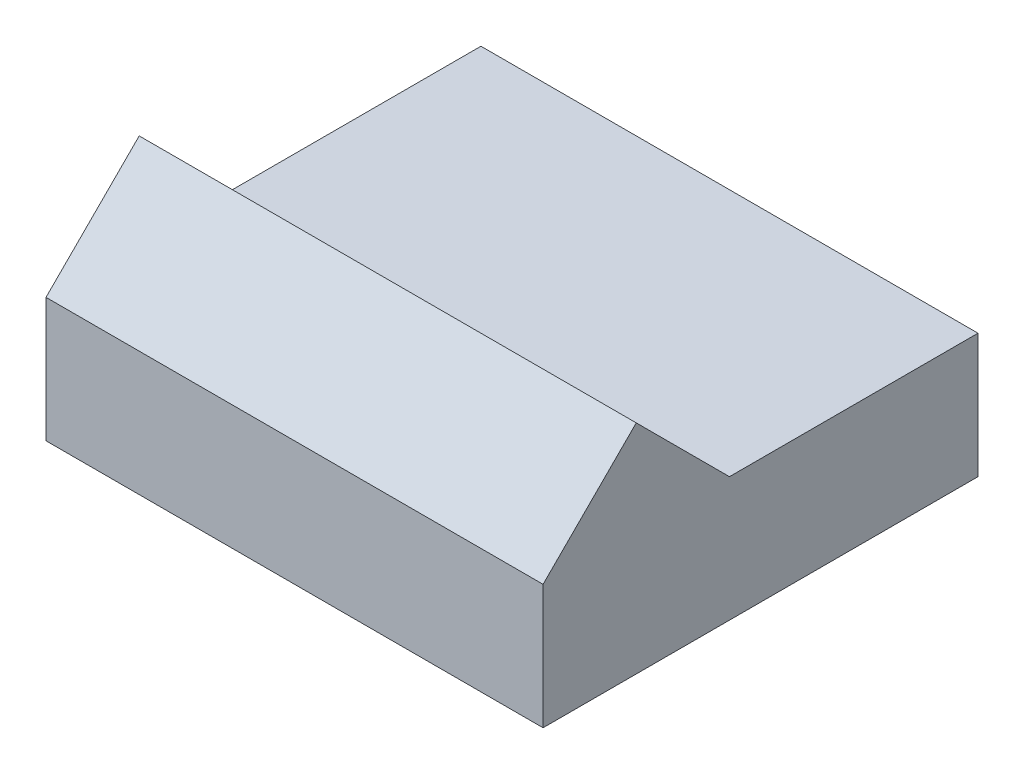
ISO-10303-21;
HEADER;
FILE_DESCRIPTION(('STEP AP214'),'2;1');
FILE_NAME('part.step','',(''),(''),'','','');
FILE_SCHEMA(('AUTOMOTIVE_DESIGN { 1 0 10303 214 1 1 1 1 }'));
ENDSEC;
DATA;
#1=APPLICATION_CONTEXT('core data for automotive mechanical design processes');
#2=APPLICATION_PROTOCOL_DEFINITION('international standard','automotive_design',2000,#1);
#3=PRODUCT_CONTEXT('',#1,'mechanical');
#4=PRODUCT('Part','Part','',(#3));
#5=PRODUCT_RELATED_PRODUCT_CATEGORY('part','',(#4));
#6=PRODUCT_DEFINITION_FORMATION('','',#4);
#7=PRODUCT_DEFINITION_CONTEXT('part definition',#1,'design');
#8=PRODUCT_DEFINITION('design','',#6,#7);
#9=PRODUCT_DEFINITION_SHAPE('','',#8);
#10=(LENGTH_UNIT() NAMED_UNIT(*) SI_UNIT(.MILLI.,.METRE.));
#11=(NAMED_UNIT(*) PLANE_ANGLE_UNIT() SI_UNIT($,.RADIAN.));
#12=(NAMED_UNIT(*) SI_UNIT($,.STERADIAN.) SOLID_ANGLE_UNIT());
#13=UNCERTAINTY_MEASURE_WITH_UNIT(LENGTH_MEASURE(1.E-05),#10,'distance_accuracy_value','');
#14=(GEOMETRIC_REPRESENTATION_CONTEXT(3) GLOBAL_UNCERTAINTY_ASSIGNED_CONTEXT((#13)) GLOBAL_UNIT_ASSIGNED_CONTEXT((#10,
#11,#12)) REPRESENTATION_CONTEXT('',''));
#15=CARTESIAN_POINT('',(0.,0.,0.));
#16=DIRECTION('',(0.,0.,1.));
#17=DIRECTION('',(1.,0.,0.));
#18=AXIS2_PLACEMENT_3D('',#15,#16,#17);
#19=CARTESIAN_POINT('',(8.,29.7963329291001,0.));
#20=DIRECTION('',(0.,-1.,0.));
#21=DIRECTION('',(0.,0.,-1.));
#22=AXIS2_PLACEMENT_3D('',#19,#20,#21);
#23=PLANE('',#22);
#24=DIRECTION('',(0.,0.,1.));
#25=VECTOR('',#24,1.);
#26=CARTESIAN_POINT('',(0.,29.7963329291001,0.));
#27=LINE('',#26,#25);
#28=CARTESIAN_POINT('',(0.,29.7963329291001,-0.000317111119585434));
#29=VERTEX_POINT('',#28);
#30=CARTESIAN_POINT('',(0.,29.7963329291001,3.99968288888042));
#31=VERTEX_POINT('',#30);
#32=EDGE_CURVE('E120',#29,#31,#27,.T.);
#33=ORIENTED_EDGE('',*,*,#32,.T.);
#34=DIRECTION('',(-1.,0.,0.));
#35=VECTOR('',#34,1.);
#36=CARTESIAN_POINT('',(8.,29.7963329291001,3.99968288888042));
#37=LINE('',#36,#35);
#38=CARTESIAN_POINT('',(8.,29.7963329291001,3.99968288888042));
#39=VERTEX_POINT('',#38);
#40=EDGE_CURVE('E11',#39,#31,#37,.T.);
#41=ORIENTED_EDGE('',*,*,#40,.F.);
#42=DIRECTION('',(0.,0.,1.));
#43=VECTOR('',#42,1.);
#44=CARTESIAN_POINT('',(8.,29.7963329291001,0.));
#45=LINE('',#44,#43);
#46=CARTESIAN_POINT('',(8.,29.7963329291001,-0.000317111119585434));
#47=VERTEX_POINT('',#46);
#48=EDGE_CURVE('E132',#47,#39,#45,.T.);
#49=ORIENTED_EDGE('',*,*,#48,.F.);
#50=DIRECTION('',(-1.,0.,0.));
#51=VECTOR('',#50,1.);
#52=CARTESIAN_POINT('',(8.,29.7963329291001,-0.000317111119585434));
#53=LINE('',#52,#51);
#54=EDGE_CURVE('E51',#47,#29,#53,.T.);
#55=ORIENTED_EDGE('',*,*,#54,.T.);
#56=EDGE_LOOP('',(#33,#41,#49,#55));
#57=FACE_BOUND('',#56,.T.);
#58=ADVANCED_FACE('F35',(#57),#23,.F.);
#59=CARTESIAN_POINT('',(8.,12.8983250201098,-12.8983250201098));
#60=DIRECTION('',(0.,-0.707106781186547,0.707106781186548));
#61=DIRECTION('',(0.,-0.707106781186548,-0.707106781186547));
#62=AXIS2_PLACEMENT_3D('',#59,#60,#61);
#63=PLANE('',#62);
#64=DIRECTION('',(0.,0.707106781186548,0.707106781186547));
#65=VECTOR('',#64,1.);
#66=CARTESIAN_POINT('',(0.,12.8983250201098,-12.8983250201098));
#67=LINE('',#66,#65);
#68=CARTESIAN_POINT('',(0.,31.2963329291001,5.49968288888041));
#69=VERTEX_POINT('',#68);
#70=EDGE_CURVE('E122',#31,#69,#67,.T.);
#71=ORIENTED_EDGE('',*,*,#70,.T.);
#72=DIRECTION('',(-1.,0.,0.));
#73=VECTOR('',#72,1.);
#74=CARTESIAN_POINT('',(8.,31.2963329291001,5.49968288888041));
#75=LINE('',#74,#73);
#76=CARTESIAN_POINT('',(8.,31.2963329291001,5.49968288888041));
#77=VERTEX_POINT('',#76);
#78=EDGE_CURVE('E43',#77,#69,#75,.T.);
#79=ORIENTED_EDGE('',*,*,#78,.F.);
#80=DIRECTION('',(0.,0.707106781186548,0.707106781186547));
#81=VECTOR('',#80,1.);
#82=CARTESIAN_POINT('',(8.,12.8983250201098,-12.8983250201098));
#83=LINE('',#82,#81);
#84=EDGE_CURVE('E83',#39,#77,#83,.T.);
#85=ORIENTED_EDGE('',*,*,#84,.F.);
#86=ORIENTED_EDGE('',*,*,#40,.T.);
#87=EDGE_LOOP('',(#71,#79,#85,#86));
#88=FACE_BOUND('',#87,.T.);
#89=ADVANCED_FACE('F152',(#88),#63,.F.);
#90=CARTESIAN_POINT('',(8.,18.3980079089902,18.3980079089902));
#91=DIRECTION('',(0.,-0.707106781186547,-0.707106781186548));
#92=DIRECTION('',(0.,0.707106781186548,-0.707106781186547));
#93=AXIS2_PLACEMENT_3D('',#90,#91,#92);
#94=PLANE('',#93);
#95=DIRECTION('',(0.,-0.707106781186548,0.707106781186547));
#96=VECTOR('',#95,1.);
#97=CARTESIAN_POINT('',(0.,18.3980079089902,18.3980079089902));
#98=LINE('',#97,#96);
#99=CARTESIAN_POINT('',(0.,29.7963329291001,6.9996828888804));
#100=VERTEX_POINT('',#99);
#101=EDGE_CURVE('E124',#69,#100,#98,.T.);
#102=ORIENTED_EDGE('',*,*,#101,.T.);
#103=DIRECTION('',(-1.,0.,0.));
#104=VECTOR('',#103,1.);
#105=CARTESIAN_POINT('',(8.,29.7963329291001,6.9996828888804));
#106=LINE('',#105,#104);
#107=CARTESIAN_POINT('',(8.,29.7963329291001,6.9996828888804));
#108=VERTEX_POINT('',#107);
#109=EDGE_CURVE('E112',#108,#100,#106,.T.);
#110=ORIENTED_EDGE('',*,*,#109,.F.);
#111=DIRECTION('',(0.,-0.707106781186548,0.707106781186547));
#112=VECTOR('',#111,1.);
#113=CARTESIAN_POINT('',(8.,18.3980079089902,18.3980079089902));
#114=LINE('',#113,#112);
#115=EDGE_CURVE('E100',#77,#108,#114,.T.);
#116=ORIENTED_EDGE('',*,*,#115,.F.);
#117=ORIENTED_EDGE('',*,*,#78,.T.);
#118=EDGE_LOOP('',(#102,#110,#116,#117));
#119=FACE_BOUND('',#118,.T.);
#120=ADVANCED_FACE('F138',(#119),#94,.F.);
#121=CARTESIAN_POINT('',(8.,0.,6.9996828888804));
#122=DIRECTION('',(0.,0.,-1.));
#123=DIRECTION('',(-1.,0.,0.));
#124=AXIS2_PLACEMENT_3D('',#121,#122,#123);
#125=PLANE('',#124);
#126=DIRECTION('',(0.,-1.,0.));
#127=VECTOR('',#126,1.);
#128=CARTESIAN_POINT('',(0.,0.,6.9996828888804));
#129=LINE('',#128,#127);
#130=CARTESIAN_POINT('',(0.,27.7963329291001,6.9996828888804));
#131=VERTEX_POINT('',#130);
#132=EDGE_CURVE('E109',#100,#131,#129,.T.);
#133=ORIENTED_EDGE('',*,*,#132,.T.);
#134=DIRECTION('',(-1.,0.,0.));
#135=VECTOR('',#134,1.);
#136=CARTESIAN_POINT('',(8.,27.7963329291001,6.9996828888804));
#137=LINE('',#136,#135);
#138=CARTESIAN_POINT('',(8.,27.7963329291001,6.9996828888804));
#139=VERTEX_POINT('',#138);
#140=EDGE_CURVE('E106',#139,#131,#137,.T.);
#141=ORIENTED_EDGE('',*,*,#140,.F.);
#142=DIRECTION('',(0.,-1.,0.));
#143=VECTOR('',#142,1.);
#144=CARTESIAN_POINT('',(8.,0.,6.9996828888804));
#145=LINE('',#144,#143);
#146=EDGE_CURVE('E93',#108,#139,#145,.T.);
#147=ORIENTED_EDGE('',*,*,#146,.F.);
#148=ORIENTED_EDGE('',*,*,#109,.T.);
#149=EDGE_LOOP('',(#133,#141,#147,#148));
#150=FACE_BOUND('',#149,.T.);
#151=ADVANCED_FACE('F107',(#150),#125,.F.);
#152=CARTESIAN_POINT('',(8.,27.7963329291001,0.));
#153=DIRECTION('',(0.,-1.,0.));
#154=DIRECTION('',(0.,0.,-1.));
#155=AXIS2_PLACEMENT_3D('',#152,#153,#154);
#156=PLANE('',#155);
#157=DIRECTION('',(0.,0.,1.));
#158=VECTOR('',#157,1.);
#159=CARTESIAN_POINT('',(0.,27.7963329291001,0.));
#160=LINE('',#159,#158);
#161=CARTESIAN_POINT('',(0.,27.7963329291001,-0.000317111119585705));
#162=VERTEX_POINT('',#161);
#163=EDGE_CURVE('E127',#162,#131,#160,.T.);
#164=ORIENTED_EDGE('',*,*,#163,.F.);
#165=DIRECTION('',(-1.,0.,0.));
#166=VECTOR('',#165,1.);
#167=CARTESIAN_POINT('',(8.,27.7963329291001,-0.000317111119585705));
#168=LINE('',#167,#166);
#169=CARTESIAN_POINT('',(8.,27.7963329291001,-0.000317111119585705));
#170=VERTEX_POINT('',#169);
#171=EDGE_CURVE('E71',#170,#162,#168,.T.);
#172=ORIENTED_EDGE('',*,*,#171,.F.);
#173=DIRECTION('',(0.,0.,1.));
#174=VECTOR('',#173,1.);
#175=CARTESIAN_POINT('',(8.,27.7963329291001,0.));
#176=LINE('',#175,#174);
#177=EDGE_CURVE('E98',#170,#139,#176,.T.);
#178=ORIENTED_EDGE('',*,*,#177,.T.);
#179=ORIENTED_EDGE('',*,*,#140,.T.);
#180=EDGE_LOOP('',(#164,#172,#178,#179));
#181=FACE_BOUND('',#180,.T.);
#182=ADVANCED_FACE('F114',(#181),#156,.T.);
#183=CARTESIAN_POINT('',(8.,0.,-0.000317111119589472));
#184=DIRECTION('',(0.,0.,-1.));
#185=DIRECTION('',(0.,1.,0.));
#186=AXIS2_PLACEMENT_3D('',#183,#184,#185);
#187=PLANE('',#186);
#188=DIRECTION('',(0.,-1.,0.));
#189=VECTOR('',#188,1.);
#190=CARTESIAN_POINT('',(0.,0.,-0.000317111119589472));
#191=LINE('',#190,#189);
#192=EDGE_CURVE('E129',#29,#162,#191,.T.);
#193=ORIENTED_EDGE('',*,*,#192,.F.);
#194=ORIENTED_EDGE('',*,*,#54,.F.);
#195=DIRECTION('',(0.,-1.,0.));
#196=VECTOR('',#195,1.);
#197=CARTESIAN_POINT('',(8.,0.,-0.000317111119589472));
#198=LINE('',#197,#196);
#199=EDGE_CURVE('E115',#47,#170,#198,.T.);
#200=ORIENTED_EDGE('',*,*,#199,.T.);
#201=ORIENTED_EDGE('',*,*,#171,.T.);
#202=EDGE_LOOP('',(#193,#194,#200,#201));
#203=FACE_BOUND('',#202,.T.);
#204=ADVANCED_FACE('F141',(#203),#187,.T.);
#205=CARTESIAN_POINT('',(8.,0.,0.));
#206=DIRECTION('',(1.,0.,0.));
#207=DIRECTION('',(0.,0.,-1.));
#208=AXIS2_PLACEMENT_3D('',#205,#206,#207);
#209=PLANE('',#208);
#210=ORIENTED_EDGE('',*,*,#48,.T.);
#211=ORIENTED_EDGE('',*,*,#84,.T.);
#212=ORIENTED_EDGE('',*,*,#115,.T.);
#213=ORIENTED_EDGE('',*,*,#146,.T.);
#214=ORIENTED_EDGE('',*,*,#177,.F.);
#215=ORIENTED_EDGE('',*,*,#199,.F.);
#216=EDGE_LOOP('',(#210,#211,#212,#213,#214,#215));
#217=FACE_BOUND('',#216,.T.);
#218=ADVANCED_FACE('F95',(#217),#209,.T.);
#219=CARTESIAN_POINT('',(0.,0.,0.));
#220=DIRECTION('',(1.,0.,0.));
#221=DIRECTION('',(0.,0.,-1.));
#222=AXIS2_PLACEMENT_3D('',#219,#220,#221);
#223=PLANE('',#222);
#224=ORIENTED_EDGE('',*,*,#32,.F.);
#225=ORIENTED_EDGE('',*,*,#192,.T.);
#226=ORIENTED_EDGE('',*,*,#163,.T.);
#227=ORIENTED_EDGE('',*,*,#132,.F.);
#228=ORIENTED_EDGE('',*,*,#101,.F.);
#229=ORIENTED_EDGE('',*,*,#70,.F.);
#230=EDGE_LOOP('',(#224,#225,#226,#227,#228,#229));
#231=FACE_BOUND('',#230,.T.);
#232=ADVANCED_FACE('F140',(#231),#223,.F.);
#233=CLOSED_SHELL('',(#58,#89,#120,#151,#182,#204,#218,#232));
#234=MANIFOLD_SOLID_BREP('B2',#233);
#235=ADVANCED_BREP_SHAPE_REPRESENTATION('',(#18,#234),#14);
#236=SHAPE_DEFINITION_REPRESENTATION(#9,#235);
ENDSEC;
END-ISO-10303-21;
